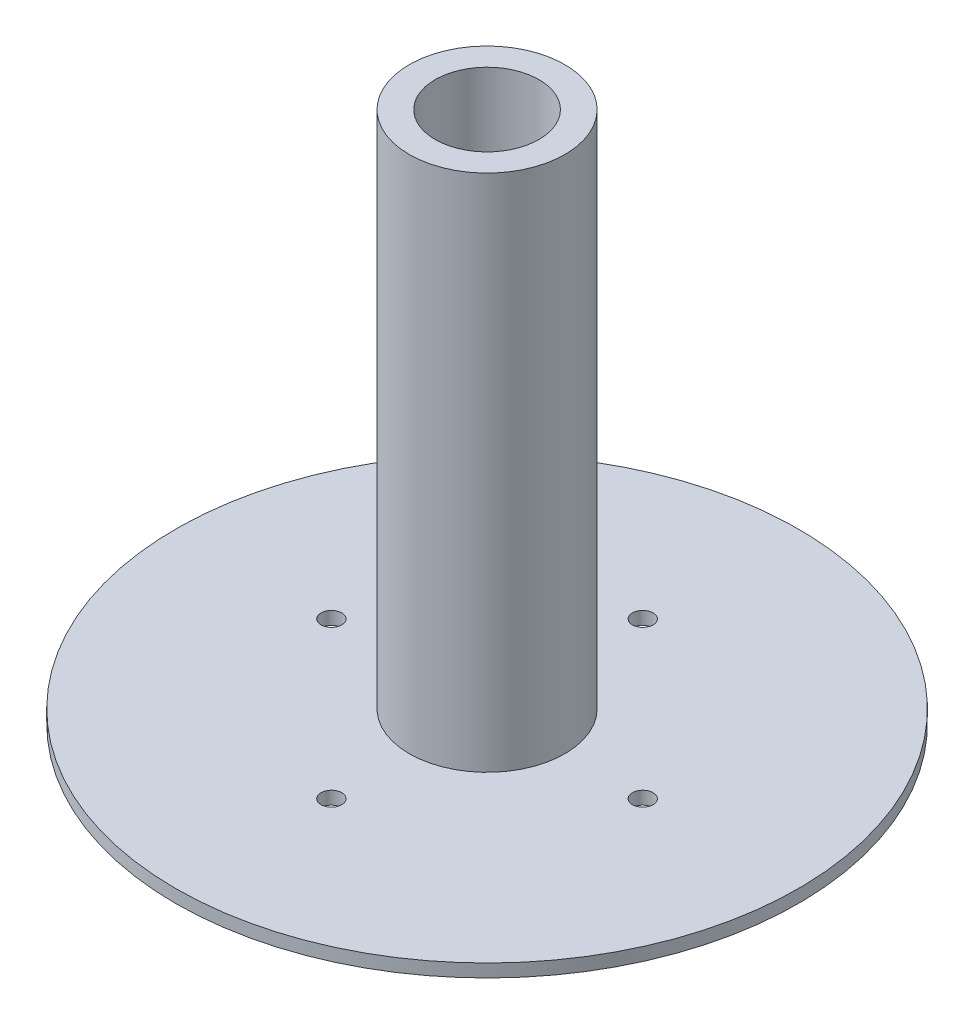
ISO-10303-21;
HEADER;
FILE_DESCRIPTION(('STEP AP214'),'2;1');
FILE_NAME('part.step','',(''),(''),'','','');
FILE_SCHEMA(('AUTOMOTIVE_DESIGN { 1 0 10303 214 1 1 1 1 }'));
ENDSEC;
DATA;
#1=APPLICATION_CONTEXT('core data for automotive mechanical design processes');
#2=APPLICATION_PROTOCOL_DEFINITION('international standard','automotive_design',2000,#1);
#3=PRODUCT_CONTEXT('',#1,'mechanical');
#4=PRODUCT('Part','Part','',(#3));
#5=PRODUCT_RELATED_PRODUCT_CATEGORY('part','',(#4));
#6=PRODUCT_DEFINITION_FORMATION('','',#4);
#7=PRODUCT_DEFINITION_CONTEXT('part definition',#1,'design');
#8=PRODUCT_DEFINITION('design','',#6,#7);
#9=PRODUCT_DEFINITION_SHAPE('','',#8);
#10=(LENGTH_UNIT() NAMED_UNIT(*) SI_UNIT(.MILLI.,.METRE.));
#11=(NAMED_UNIT(*) PLANE_ANGLE_UNIT() SI_UNIT($,.RADIAN.));
#12=(NAMED_UNIT(*) SI_UNIT($,.STERADIAN.) SOLID_ANGLE_UNIT());
#13=UNCERTAINTY_MEASURE_WITH_UNIT(LENGTH_MEASURE(1.E-05),#10,'distance_accuracy_value','');
#14=(GEOMETRIC_REPRESENTATION_CONTEXT(3) GLOBAL_UNCERTAINTY_ASSIGNED_CONTEXT((#13)) GLOBAL_UNIT_ASSIGNED_CONTEXT((#10,
#11,#12)) REPRESENTATION_CONTEXT('',''));
#15=CARTESIAN_POINT('',(0.,0.,0.));
#16=DIRECTION('',(0.,0.,1.));
#17=DIRECTION('',(1.,0.,0.));
#18=AXIS2_PLACEMENT_3D('',#15,#16,#17);
#19=CARTESIAN_POINT('',(0.,5.,0.));
#20=DIRECTION('',(0.,-1.,0.));
#21=DIRECTION('',(0.,0.,-1.));
#22=AXIS2_PLACEMENT_3D('',#19,#20,#21);
#23=CYLINDRICAL_SURFACE('',#22,120.);
#24=CARTESIAN_POINT('',(0.,5.,0.));
#25=DIRECTION('',(0.,1.,0.));
#26=DIRECTION('',(0.,0.,1.));
#27=AXIS2_PLACEMENT_3D('',#24,#25,#26);
#28=CIRCLE('',#27,120.);
#29=CARTESIAN_POINT('',(0.,5.,120.));
#30=VERTEX_POINT('',#29);
#31=EDGE_CURVE('E39',#30,#30,#28,.T.);
#32=ORIENTED_EDGE('',*,*,#31,.F.);
#33=EDGE_LOOP('',(#32));
#34=FACE_BOUND('',#33,.T.);
#35=CARTESIAN_POINT('',(0.,0.,0.));
#36=DIRECTION('',(0.,1.,0.));
#37=DIRECTION('',(0.,0.,1.));
#38=AXIS2_PLACEMENT_3D('',#35,#36,#37);
#39=CIRCLE('',#38,120.);
#40=CARTESIAN_POINT('',(0.,0.,120.));
#41=VERTEX_POINT('',#40);
#42=EDGE_CURVE('E43',#41,#41,#39,.T.);
#43=ORIENTED_EDGE('',*,*,#42,.T.);
#44=EDGE_LOOP('',(#43));
#45=FACE_BOUND('',#44,.T.);
#46=ADVANCED_FACE('F33',(#34,#45),#23,.T.);
#47=CARTESIAN_POINT('',(0.,5.,0.));
#48=DIRECTION('',(0.,1.,0.));
#49=DIRECTION('',(0.,0.,1.));
#50=AXIS2_PLACEMENT_3D('',#47,#48,#49);
#51=PLANE('',#50);
#52=CARTESIAN_POINT('',(0.,5.,0.));
#53=DIRECTION('',(0.,1.,0.));
#54=DIRECTION('',(0.,0.,1.));
#55=AXIS2_PLACEMENT_3D('',#52,#53,#54);
#56=CIRCLE('',#55,30.);
#57=CARTESIAN_POINT('',(0.,5.,30.));
#58=VERTEX_POINT('',#57);
#59=EDGE_CURVE('E200',#58,#58,#56,.T.);
#60=ORIENTED_EDGE('',*,*,#59,.F.);
#61=EDGE_LOOP('',(#60));
#62=FACE_BOUND('',#61,.T.);
#63=CARTESIAN_POINT('',(0.,5.,-60.));
#64=DIRECTION('',(0.,1.,0.));
#65=DIRECTION('',(0.,0.,1.));
#66=AXIS2_PLACEMENT_3D('',#63,#64,#65);
#67=CIRCLE('',#66,3.99999999999999);
#68=CARTESIAN_POINT('',(0.,5.,-56.));
#69=VERTEX_POINT('',#68);
#70=EDGE_CURVE('E67',#69,#69,#67,.T.);
#71=ORIENTED_EDGE('',*,*,#70,.F.);
#72=EDGE_LOOP('',(#71));
#73=FACE_BOUND('',#72,.T.);
#74=CARTESIAN_POINT('',(-60.,5.,0.));
#75=DIRECTION('',(0.,1.,0.));
#76=DIRECTION('',(0.,0.,1.));
#77=AXIS2_PLACEMENT_3D('',#74,#75,#76);
#78=CIRCLE('',#77,3.99999999999999);
#79=CARTESIAN_POINT('',(-60.,5.,3.99999999999999));
#80=VERTEX_POINT('',#79);
#81=EDGE_CURVE('E55',#80,#80,#78,.T.);
#82=ORIENTED_EDGE('',*,*,#81,.F.);
#83=EDGE_LOOP('',(#82));
#84=FACE_BOUND('',#83,.T.);
#85=CARTESIAN_POINT('',(0.,5.,60.));
#86=DIRECTION('',(0.,1.,0.));
#87=DIRECTION('',(0.,0.,1.));
#88=AXIS2_PLACEMENT_3D('',#85,#86,#87);
#89=CIRCLE('',#88,3.99999999999999);
#90=CARTESIAN_POINT('',(0.,5.,64.));
#91=VERTEX_POINT('',#90);
#92=EDGE_CURVE('E54',#91,#91,#89,.T.);
#93=ORIENTED_EDGE('',*,*,#92,.F.);
#94=EDGE_LOOP('',(#93));
#95=FACE_BOUND('',#94,.T.);
#96=CARTESIAN_POINT('',(60.,5.,0.));
#97=DIRECTION('',(0.,1.,0.));
#98=DIRECTION('',(0.,0.,1.));
#99=AXIS2_PLACEMENT_3D('',#96,#97,#98);
#100=CIRCLE('',#99,3.99999999999999);
#101=CARTESIAN_POINT('',(60.,5.,3.99999999999999));
#102=VERTEX_POINT('',#101);
#103=EDGE_CURVE('E72',#102,#102,#100,.T.);
#104=ORIENTED_EDGE('',*,*,#103,.F.);
#105=EDGE_LOOP('',(#104));
#106=FACE_BOUND('',#105,.T.);
#107=ORIENTED_EDGE('',*,*,#31,.T.);
#108=EDGE_LOOP('',(#107));
#109=FACE_BOUND('',#108,.T.);
#110=ADVANCED_FACE('F93',(#62,#73,#84,#95,#106,#109),#51,.T.);
#111=CARTESIAN_POINT('',(0.,0.,0.));
#112=DIRECTION('',(0.,1.,0.));
#113=DIRECTION('',(0.,0.,1.));
#114=AXIS2_PLACEMENT_3D('',#111,#112,#113);
#115=PLANE('',#114);
#116=CARTESIAN_POINT('',(0.,0.,-60.));
#117=DIRECTION('',(0.,1.,0.));
#118=DIRECTION('',(0.,0.,1.));
#119=AXIS2_PLACEMENT_3D('',#116,#117,#118);
#120=CIRCLE('',#119,3.99999999999999);
#121=CARTESIAN_POINT('',(0.,0.,-56.));
#122=VERTEX_POINT('',#121);
#123=EDGE_CURVE('E62',#122,#122,#120,.T.);
#124=ORIENTED_EDGE('',*,*,#123,.T.);
#125=EDGE_LOOP('',(#124));
#126=FACE_BOUND('',#125,.T.);
#127=CARTESIAN_POINT('',(-60.,0.,0.));
#128=DIRECTION('',(0.,1.,0.));
#129=DIRECTION('',(0.,0.,1.));
#130=AXIS2_PLACEMENT_3D('',#127,#128,#129);
#131=CIRCLE('',#130,3.99999999999999);
#132=CARTESIAN_POINT('',(-60.,0.,3.99999999999999));
#133=VERTEX_POINT('',#132);
#134=EDGE_CURVE('E52',#133,#133,#131,.T.);
#135=ORIENTED_EDGE('',*,*,#134,.T.);
#136=EDGE_LOOP('',(#135));
#137=FACE_BOUND('',#136,.T.);
#138=CARTESIAN_POINT('',(0.,0.,60.));
#139=DIRECTION('',(0.,1.,0.));
#140=DIRECTION('',(0.,0.,1.));
#141=AXIS2_PLACEMENT_3D('',#138,#139,#140);
#142=CIRCLE('',#141,3.99999999999999);
#143=CARTESIAN_POINT('',(0.,0.,64.));
#144=VERTEX_POINT('',#143);
#145=EDGE_CURVE('E59',#144,#144,#142,.T.);
#146=ORIENTED_EDGE('',*,*,#145,.T.);
#147=EDGE_LOOP('',(#146));
#148=FACE_BOUND('',#147,.T.);
#149=CARTESIAN_POINT('',(60.,0.,0.));
#150=DIRECTION('',(0.,1.,0.));
#151=DIRECTION('',(0.,0.,1.));
#152=AXIS2_PLACEMENT_3D('',#149,#150,#151);
#153=CIRCLE('',#152,3.99999999999999);
#154=CARTESIAN_POINT('',(60.,0.,3.99999999999999));
#155=VERTEX_POINT('',#154);
#156=EDGE_CURVE('E48',#155,#155,#153,.T.);
#157=ORIENTED_EDGE('',*,*,#156,.T.);
#158=EDGE_LOOP('',(#157));
#159=FACE_BOUND('',#158,.T.);
#160=ORIENTED_EDGE('',*,*,#42,.F.);
#161=EDGE_LOOP('',(#160));
#162=FACE_BOUND('',#161,.T.);
#163=ADVANCED_FACE('F79',(#126,#137,#148,#159,#162),#115,.F.);
#164=CARTESIAN_POINT('',(60.,5.,0.));
#165=DIRECTION('',(0.,1.,0.));
#166=DIRECTION('',(0.,0.,1.));
#167=AXIS2_PLACEMENT_3D('',#164,#165,#166);
#168=CYLINDRICAL_SURFACE('',#167,3.99999999999999);
#169=ORIENTED_EDGE('',*,*,#103,.T.);
#170=EDGE_LOOP('',(#169));
#171=FACE_BOUND('',#170,.T.);
#172=ORIENTED_EDGE('',*,*,#156,.F.);
#173=EDGE_LOOP('',(#172));
#174=FACE_BOUND('',#173,.T.);
#175=ADVANCED_FACE('F82',(#171,#174),#168,.F.);
#176=CARTESIAN_POINT('',(0.,5.,60.));
#177=DIRECTION('',(0.,1.,0.));
#178=DIRECTION('',(0.,0.,1.));
#179=AXIS2_PLACEMENT_3D('',#176,#177,#178);
#180=CYLINDRICAL_SURFACE('',#179,3.99999999999999);
#181=ORIENTED_EDGE('',*,*,#92,.T.);
#182=EDGE_LOOP('',(#181));
#183=FACE_BOUND('',#182,.T.);
#184=ORIENTED_EDGE('',*,*,#145,.F.);
#185=EDGE_LOOP('',(#184));
#186=FACE_BOUND('',#185,.T.);
#187=ADVANCED_FACE('F84',(#183,#186),#180,.F.);
#188=CARTESIAN_POINT('',(-60.,5.,0.));
#189=DIRECTION('',(0.,1.,0.));
#190=DIRECTION('',(0.,0.,1.));
#191=AXIS2_PLACEMENT_3D('',#188,#189,#190);
#192=CYLINDRICAL_SURFACE('',#191,3.99999999999999);
#193=ORIENTED_EDGE('',*,*,#81,.T.);
#194=EDGE_LOOP('',(#193));
#195=FACE_BOUND('',#194,.T.);
#196=ORIENTED_EDGE('',*,*,#134,.F.);
#197=EDGE_LOOP('',(#196));
#198=FACE_BOUND('',#197,.T.);
#199=ADVANCED_FACE('F90',(#195,#198),#192,.F.);
#200=CARTESIAN_POINT('',(0.,5.,-60.));
#201=DIRECTION('',(0.,1.,0.));
#202=DIRECTION('',(0.,0.,1.));
#203=AXIS2_PLACEMENT_3D('',#200,#201,#202);
#204=CYLINDRICAL_SURFACE('',#203,3.99999999999999);
#205=ORIENTED_EDGE('',*,*,#70,.T.);
#206=EDGE_LOOP('',(#205));
#207=FACE_BOUND('',#206,.T.);
#208=ORIENTED_EDGE('',*,*,#123,.F.);
#209=EDGE_LOOP('',(#208));
#210=FACE_BOUND('',#209,.T.);
#211=ADVANCED_FACE('F127',(#207,#210),#204,.F.);
#212=CARTESIAN_POINT('',(0.,205.,0.));
#213=DIRECTION('',(0.,1.,0.));
#214=DIRECTION('',(0.,0.,1.));
#215=AXIS2_PLACEMENT_3D('',#212,#213,#214);
#216=PLANE('',#215);
#217=CARTESIAN_POINT('',(0.,205.,0.));
#218=DIRECTION('',(0.,1.,0.));
#219=DIRECTION('',(0.,0.,1.));
#220=AXIS2_PLACEMENT_3D('',#217,#218,#219);
#221=CIRCLE('',#220,30.);
#222=CARTESIAN_POINT('',(0.,205.,30.));
#223=VERTEX_POINT('',#222);
#224=EDGE_CURVE('E198',#223,#223,#221,.T.);
#225=ORIENTED_EDGE('',*,*,#224,.T.);
#226=EDGE_LOOP('',(#225));
#227=FACE_BOUND('',#226,.T.);
#228=CARTESIAN_POINT('',(0.,205.,0.));
#229=DIRECTION('',(0.,1.,0.));
#230=DIRECTION('',(0.,0.,1.));
#231=AXIS2_PLACEMENT_3D('',#228,#229,#230);
#232=CIRCLE('',#231,20.);
#233=CARTESIAN_POINT('',(0.,205.,20.));
#234=VERTEX_POINT('',#233);
#235=EDGE_CURVE('E204',#234,#234,#232,.T.);
#236=ORIENTED_EDGE('',*,*,#235,.F.);
#237=EDGE_LOOP('',(#236));
#238=FACE_BOUND('',#237,.T.);
#239=ADVANCED_FACE('F121',(#227,#238),#216,.T.);
#240=CARTESIAN_POINT('',(0.,205.,0.));
#241=DIRECTION('',(0.,-1.,0.));
#242=DIRECTION('',(0.,0.,-1.));
#243=AXIS2_PLACEMENT_3D('',#240,#241,#242);
#244=CYLINDRICAL_SURFACE('',#243,30.);
#245=ORIENTED_EDGE('',*,*,#224,.F.);
#246=EDGE_LOOP('',(#245));
#247=FACE_BOUND('',#246,.T.);
#248=ORIENTED_EDGE('',*,*,#59,.T.);
#249=EDGE_LOOP('',(#248));
#250=FACE_BOUND('',#249,.T.);
#251=ADVANCED_FACE('F115',(#247,#250),#244,.T.);
#252=CARTESIAN_POINT('',(0.,205.,0.));
#253=DIRECTION('',(0.,-1.,0.));
#254=DIRECTION('',(0.,0.,-1.));
#255=AXIS2_PLACEMENT_3D('',#252,#253,#254);
#256=CYLINDRICAL_SURFACE('',#255,20.);
#257=ORIENTED_EDGE('',*,*,#235,.T.);
#258=EDGE_LOOP('',(#257));
#259=FACE_BOUND('',#258,.T.);
#260=CARTESIAN_POINT('',(0.,5.,0.));
#261=DIRECTION('',(0.,1.,0.));
#262=DIRECTION('',(0.,0.,1.));
#263=AXIS2_PLACEMENT_3D('',#260,#261,#262);
#264=CIRCLE('',#263,20.);
#265=CARTESIAN_POINT('',(0.,5.,20.));
#266=VERTEX_POINT('',#265);
#267=EDGE_CURVE('E10',#266,#266,#264,.F.);
#268=ORIENTED_EDGE('',*,*,#267,.T.);
#269=EDGE_LOOP('',(#268));
#270=FACE_BOUND('',#269,.T.);
#271=ADVANCED_FACE('F110',(#259,#270),#256,.F.);
#272=ORIENTED_EDGE('',*,*,#267,.F.);
#273=EDGE_LOOP('',(#272));
#274=FACE_BOUND('',#273,.T.);
#275=ADVANCED_FACE('F102',(#274),#51,.T.);
#276=CLOSED_SHELL('',(#46,#110,#163,#175,#187,#199,#211,#239,#251,#271,#275));
#277=MANIFOLD_SOLID_BREP('B2',#276);
#278=ADVANCED_BREP_SHAPE_REPRESENTATION('',(#18,#277),#14);
#279=SHAPE_DEFINITION_REPRESENTATION(#9,#278);
ENDSEC;
END-ISO-10303-21;
